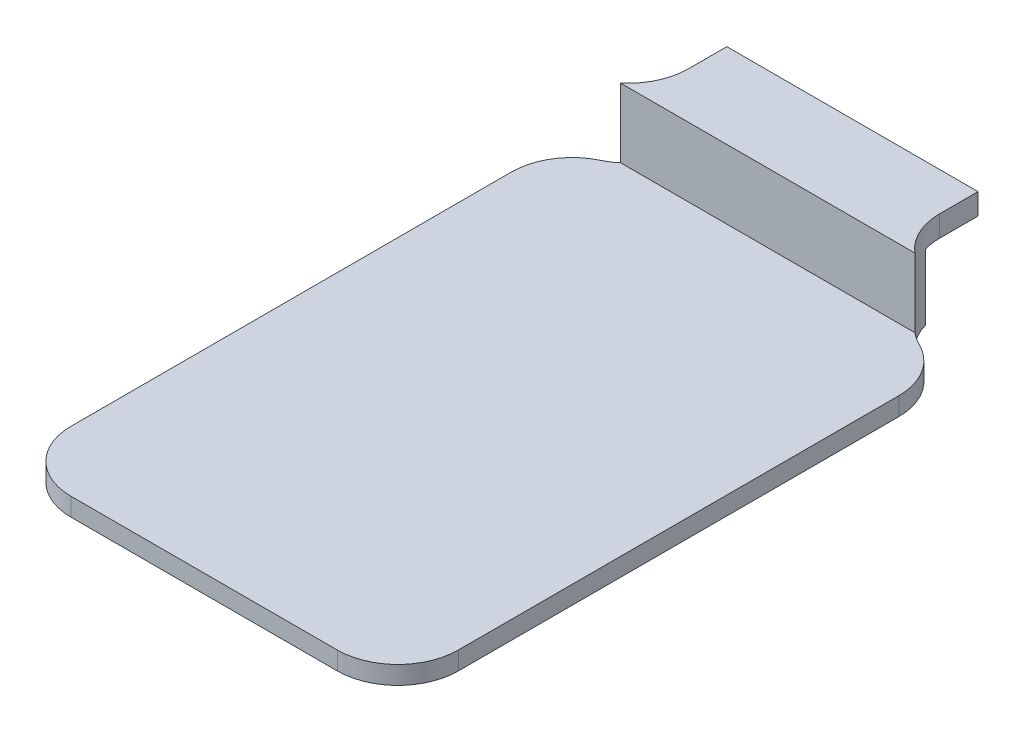
ISO-10303-21;
HEADER;
FILE_DESCRIPTION(('STEP AP214'),'2;1');
FILE_NAME('part.step','',(''),(''),'','','');
FILE_SCHEMA(('AUTOMOTIVE_DESIGN { 1 0 10303 214 1 1 1 1 }'));
ENDSEC;
DATA;
#1=APPLICATION_CONTEXT('core data for automotive mechanical design processes');
#2=APPLICATION_PROTOCOL_DEFINITION('international standard','automotive_design',2000,#1);
#3=PRODUCT_CONTEXT('',#1,'mechanical');
#4=PRODUCT('Part','Part','',(#3));
#5=PRODUCT_RELATED_PRODUCT_CATEGORY('part','',(#4));
#6=PRODUCT_DEFINITION_FORMATION('','',#4);
#7=PRODUCT_DEFINITION_CONTEXT('part definition',#1,'design');
#8=PRODUCT_DEFINITION('design','',#6,#7);
#9=PRODUCT_DEFINITION_SHAPE('','',#8);
#10=(LENGTH_UNIT() NAMED_UNIT(*) SI_UNIT(.MILLI.,.METRE.));
#11=(NAMED_UNIT(*) PLANE_ANGLE_UNIT() SI_UNIT($,.RADIAN.));
#12=(NAMED_UNIT(*) SI_UNIT($,.STERADIAN.) SOLID_ANGLE_UNIT());
#13=UNCERTAINTY_MEASURE_WITH_UNIT(LENGTH_MEASURE(1.E-05),#10,'distance_accuracy_value','');
#14=(GEOMETRIC_REPRESENTATION_CONTEXT(3) GLOBAL_UNCERTAINTY_ASSIGNED_CONTEXT((#13)) GLOBAL_UNIT_ASSIGNED_CONTEXT((#10,
#11,#12)) REPRESENTATION_CONTEXT('',''));
#15=CARTESIAN_POINT('',(0.,0.,0.));
#16=DIRECTION('',(0.,0.,1.));
#17=DIRECTION('',(1.,0.,0.));
#18=AXIS2_PLACEMENT_3D('',#15,#16,#17);
#19=CARTESIAN_POINT('',(11.9303029711438,3.,-52.9287545222048));
#20=DIRECTION('',(1.,0.,0.));
#21=DIRECTION('',(0.,0.,-1.));
#22=AXIS2_PLACEMENT_3D('',#19,#20,#21);
#23=PLANE('',#22);
#24=DIRECTION('',(0.,0.,-1.));
#25=VECTOR('',#24,1.);
#26=CARTESIAN_POINT('',(11.9303029711438,10.9,0.));
#27=LINE('',#26,#25);
#28=CARTESIAN_POINT('',(11.9303029711438,10.9,-55.5843161981421));
#29=VERTEX_POINT('',#28);
#30=CARTESIAN_POINT('',(11.9303029711438,10.9,-61.9287545222048));
#31=VERTEX_POINT('',#30);
#32=EDGE_CURVE('E154',#29,#31,#27,.T.);
#33=ORIENTED_EDGE('',*,*,#32,.F.);
#34=DIRECTION('',(0.,1.,0.));
#35=VECTOR('',#34,1.);
#36=CARTESIAN_POINT('',(11.9303029711438,3.,-55.5843161981421));
#37=LINE('',#36,#35);
#38=CARTESIAN_POINT('',(11.9303029711438,14.4,-55.5843161981421));
#39=VERTEX_POINT('',#38);
#40=EDGE_CURVE('E221',#29,#39,#37,.T.);
#41=ORIENTED_EDGE('',*,*,#40,.T.);
#42=DIRECTION('',(0.,0.,1.));
#43=VECTOR('',#42,1.);
#44=CARTESIAN_POINT('',(11.9303029711438,14.4,0.));
#45=LINE('',#44,#43);
#46=CARTESIAN_POINT('',(11.9303029711438,14.4,-61.9287545222048));
#47=VERTEX_POINT('',#46);
#48=EDGE_CURVE('E172',#47,#39,#45,.T.);
#49=ORIENTED_EDGE('',*,*,#48,.F.);
#50=DIRECTION('',(0.,-1.,0.));
#51=VECTOR('',#50,1.);
#52=CARTESIAN_POINT('',(11.9303029711438,0.,-61.9287545222048));
#53=LINE('',#52,#51);
#54=EDGE_CURVE('E166',#47,#31,#53,.T.);
#55=ORIENTED_EDGE('',*,*,#54,.T.);
#56=EDGE_LOOP('',(#33,#41,#49,#55));
#57=FACE_BOUND('',#56,.T.);
#58=ADVANCED_FACE('F42',(#57),#23,.F.);
#59=CARTESIAN_POINT('',(53.4303029711438,3.,-52.9287545222048));
#60=DIRECTION('',(-1.,0.,0.));
#61=DIRECTION('',(0.,0.,1.));
#62=AXIS2_PLACEMENT_3D('',#59,#60,#61);
#63=PLANE('',#62);
#64=DIRECTION('',(0.,0.,1.));
#65=VECTOR('',#64,1.);
#66=CARTESIAN_POINT('',(53.4303029711438,14.4,0.));
#67=LINE('',#66,#65);
#68=CARTESIAN_POINT('',(53.4303029711438,14.4,-61.9287545222048));
#69=VERTEX_POINT('',#68);
#70=CARTESIAN_POINT('',(53.4303029711438,14.4,-55.5843161981421));
#71=VERTEX_POINT('',#70);
#72=EDGE_CURVE('E167',#69,#71,#67,.T.);
#73=ORIENTED_EDGE('',*,*,#72,.T.);
#74=DIRECTION('',(0.,1.,0.));
#75=VECTOR('',#74,1.);
#76=CARTESIAN_POINT('',(53.4303029711438,3.,-55.5843161981421));
#77=LINE('',#76,#75);
#78=CARTESIAN_POINT('',(53.4303029711438,10.9,-55.5843161981421));
#79=VERTEX_POINT('',#78);
#80=EDGE_CURVE('E225',#71,#79,#77,.F.);
#81=ORIENTED_EDGE('',*,*,#80,.T.);
#82=DIRECTION('',(0.,0.,-1.));
#83=VECTOR('',#82,1.);
#84=CARTESIAN_POINT('',(53.4303029711438,10.9,0.));
#85=LINE('',#84,#83);
#86=CARTESIAN_POINT('',(53.4303029711438,10.9,-61.9287545222048));
#87=VERTEX_POINT('',#86);
#88=EDGE_CURVE('E264',#79,#87,#85,.T.);
#89=ORIENTED_EDGE('',*,*,#88,.T.);
#90=DIRECTION('',(0.,-1.,0.));
#91=VECTOR('',#90,1.);
#92=CARTESIAN_POINT('',(53.4303029711438,0.,-61.9287545222048));
#93=LINE('',#92,#91);
#94=EDGE_CURVE('E177',#69,#87,#93,.T.);
#95=ORIENTED_EDGE('',*,*,#94,.F.);
#96=EDGE_LOOP('',(#73,#81,#89,#95));
#97=FACE_BOUND('',#96,.T.);
#98=ADVANCED_FACE('F262',(#97),#63,.F.);
#99=CARTESIAN_POINT('',(11.9303029711438,3.,-52.9287545222048));
#100=DIRECTION('',(0.,0.,1.));
#101=DIRECTION('',(1.,0.,0.));
#102=AXIS2_PLACEMENT_3D('',#99,#100,#101);
#103=PLANE('',#102);
#104=DIRECTION('',(-1.,0.,0.));
#105=VECTOR('',#104,1.);
#106=CARTESIAN_POINT('',(11.9303029711438,0.,-52.9287545222048));
#107=LINE('',#106,#105);
#108=CARTESIAN_POINT('',(53.7893490668201,0.,-52.9287545222048));
#109=VERTEX_POINT('',#108);
#110=CARTESIAN_POINT('',(11.5712568754674,0.,-52.9287545222048));
#111=VERTEX_POINT('',#110);
#112=EDGE_CURVE('E186',#109,#111,#107,.T.);
#113=ORIENTED_EDGE('',*,*,#112,.T.);
#114=DIRECTION('',(0.,1.,0.));
#115=VECTOR('',#114,1.);
#116=CARTESIAN_POINT('',(11.5712568754674,0.,-52.9287545222048));
#117=LINE('',#116,#115);
#118=CARTESIAN_POINT('',(11.5712568754674,10.9,-52.9287545222048));
#119=VERTEX_POINT('',#118);
#120=EDGE_CURVE('E239',#111,#119,#117,.T.);
#121=ORIENTED_EDGE('',*,*,#120,.T.);
#122=DIRECTION('',(1.,0.,0.));
#123=VECTOR('',#122,1.);
#124=CARTESIAN_POINT('',(11.9303029711438,10.9,-52.9287545222048));
#125=LINE('',#124,#123);
#126=CARTESIAN_POINT('',(53.7893490668201,10.9,-52.9287545222048));
#127=VERTEX_POINT('',#126);
#128=EDGE_CURVE('E179',#119,#127,#125,.T.);
#129=ORIENTED_EDGE('',*,*,#128,.T.);
#130=DIRECTION('',(0.,1.,0.));
#131=VECTOR('',#130,1.);
#132=CARTESIAN_POINT('',(53.7893490668201,10.9,-52.9287545222048));
#133=LINE('',#132,#131);
#134=EDGE_CURVE('E246',#127,#109,#133,.F.);
#135=ORIENTED_EDGE('',*,*,#134,.T.);
#136=EDGE_LOOP('',(#113,#121,#129,#135));
#137=FACE_BOUND('',#136,.T.);
#138=ADVANCED_FACE('F307',(#137),#103,.F.);
#139=CARTESIAN_POINT('',(0.,3.,0.));
#140=DIRECTION('',(0.,1.,0.));
#141=DIRECTION('',(0.,0.,1.));
#142=AXIS2_PLACEMENT_3D('',#139,#140,#141);
#143=PLANE('',#142);
#144=DIRECTION('',(0.,0.,1.));
#145=VECTOR('',#144,1.);
#146=CARTESIAN_POINT('',(0.670302971143767,3.,45.2049139132329));
#147=LINE('',#146,#145);
#148=CARTESIAN_POINT('',(0.670302971143767,3.,-37.5950860867671));
#149=VERTEX_POINT('',#148);
#150=CARTESIAN_POINT('',(0.670302971143767,3.,35.2049139132329));
#151=VERTEX_POINT('',#150);
#152=EDGE_CURVE('E274',#149,#151,#147,.T.);
#153=ORIENTED_EDGE('',*,*,#152,.T.);
#154=CARTESIAN_POINT('',(10.6703029711438,3.,35.2049139132329));
#155=DIRECTION('',(0.,1.,0.));
#156=DIRECTION('',(0.,0.,1.));
#157=AXIS2_PLACEMENT_3D('',#154,#155,#156);
#158=CIRCLE('',#157,10.);
#159=CARTESIAN_POINT('',(10.6703029711438,3.,45.2049139132329));
#160=VERTEX_POINT('',#159);
#161=EDGE_CURVE('E200',#151,#160,#158,.T.);
#162=ORIENTED_EDGE('',*,*,#161,.T.);
#163=DIRECTION('',(1.,0.,0.));
#164=VECTOR('',#163,1.);
#165=CARTESIAN_POINT('',(0.670302971143767,3.,45.2049139132329));
#166=LINE('',#165,#164);
#167=CARTESIAN_POINT('',(54.6903029711438,3.,45.2049139132329));
#168=VERTEX_POINT('',#167);
#169=EDGE_CURVE('E270',#160,#168,#166,.T.);
#170=ORIENTED_EDGE('',*,*,#169,.T.);
#171=CARTESIAN_POINT('',(54.6903029711438,3.,35.2049139132329));
#172=DIRECTION('',(0.,1.,0.));
#173=DIRECTION('',(0.,0.,1.));
#174=AXIS2_PLACEMENT_3D('',#171,#172,#173);
#175=CIRCLE('',#174,10.);
#176=CARTESIAN_POINT('',(64.6903029711438,3.,35.2049139132329));
#177=VERTEX_POINT('',#176);
#178=EDGE_CURVE('E198',#168,#177,#175,.T.);
#179=ORIENTED_EDGE('',*,*,#178,.T.);
#180=DIRECTION('',(0.,0.,-1.));
#181=VECTOR('',#180,1.);
#182=CARTESIAN_POINT('',(64.6903029711438,3.,45.2049139132329));
#183=LINE('',#182,#181);
#184=CARTESIAN_POINT('',(64.6903029711438,3.,-37.5950860867671));
#185=VERTEX_POINT('',#184);
#186=EDGE_CURVE('E277',#177,#185,#183,.T.);
#187=ORIENTED_EDGE('',*,*,#186,.T.);
#188=CARTESIAN_POINT('',(54.6903029711438,3.,-37.5950860867671));
#189=DIRECTION('',(0.,1.,0.));
#190=DIRECTION('',(0.,0.,1.));
#191=AXIS2_PLACEMENT_3D('',#188,#189,#190);
#192=CIRCLE('',#191,10.);
#193=CARTESIAN_POINT('',(59.0603029711438,3.,-46.5897011424546));
#194=VERTEX_POINT('',#193);
#195=EDGE_CURVE('E195',#185,#194,#192,.T.);
#196=ORIENTED_EDGE('',*,*,#195,.T.);
#197=CARTESIAN_POINT('',(63.4303029711438,3.,-55.5843161981421));
#198=DIRECTION('',(0.,1.,0.));
#199=DIRECTION('',(0.,0.,1.));
#200=AXIS2_PLACEMENT_3D('',#197,#198,#199);
#201=CIRCLE('',#200,10.);
#202=CARTESIAN_POINT('',(56.996612317567,3.,-47.9287545222048));
#203=VERTEX_POINT('',#202);
#204=EDGE_CURVE('E251',#194,#203,#201,.F.);
#205=ORIENTED_EDGE('',*,*,#204,.T.);
#206=DIRECTION('',(1.,0.,0.));
#207=VECTOR('',#206,1.);
#208=CARTESIAN_POINT('',(11.9303029711438,3.,-47.9287545222048));
#209=LINE('',#208,#207);
#210=CARTESIAN_POINT('',(8.36399362472046,3.,-47.9287545222048));
#211=VERTEX_POINT('',#210);
#212=EDGE_CURVE('E63',#211,#203,#209,.T.);
#213=ORIENTED_EDGE('',*,*,#212,.F.);
#214=CARTESIAN_POINT('',(1.93030297114375,3.,-55.5843161981421));
#215=DIRECTION('',(0.,1.,0.));
#216=DIRECTION('',(0.,0.,1.));
#217=AXIS2_PLACEMENT_3D('',#214,#215,#216);
#218=CIRCLE('',#217,10.);
#219=CARTESIAN_POINT('',(6.30030297114376,3.,-46.5897011424546));
#220=VERTEX_POINT('',#219);
#221=EDGE_CURVE('E234',#211,#220,#218,.F.);
#222=ORIENTED_EDGE('',*,*,#221,.T.);
#223=CARTESIAN_POINT('',(10.6703029711438,3.,-37.5950860867671));
#224=DIRECTION('',(0.,1.,0.));
#225=DIRECTION('',(0.,0.,1.));
#226=AXIS2_PLACEMENT_3D('',#223,#224,#225);
#227=CIRCLE('',#226,10.);
#228=EDGE_CURVE('E193',#220,#149,#227,.T.);
#229=ORIENTED_EDGE('',*,*,#228,.T.);
#230=EDGE_LOOP('',(#153,#162,#170,#179,#187,#196,#205,#213,#222,#229));
#231=FACE_BOUND('',#230,.T.);
#232=ADVANCED_FACE('F299',(#231),#143,.T.);
#233=CARTESIAN_POINT('',(0.,0.,0.));
#234=DIRECTION('',(0.,1.,0.));
#235=DIRECTION('',(0.,0.,1.));
#236=AXIS2_PLACEMENT_3D('',#233,#234,#235);
#237=PLANE('',#236);
#238=DIRECTION('',(1.,0.,0.));
#239=VECTOR('',#238,1.);
#240=CARTESIAN_POINT('',(0.670302971143767,0.,45.2049139132329));
#241=LINE('',#240,#239);
#242=CARTESIAN_POINT('',(10.6703029711438,0.,45.2049139132329));
#243=VERTEX_POINT('',#242);
#244=CARTESIAN_POINT('',(54.6903029711438,0.,45.2049139132329));
#245=VERTEX_POINT('',#244);
#246=EDGE_CURVE('E268',#243,#245,#241,.T.);
#247=ORIENTED_EDGE('',*,*,#246,.F.);
#248=CARTESIAN_POINT('',(10.6703029711438,0.,35.2049139132329));
#249=DIRECTION('',(0.,1.,0.));
#250=DIRECTION('',(0.,0.,1.));
#251=AXIS2_PLACEMENT_3D('',#248,#249,#250);
#252=CIRCLE('',#251,10.);
#253=CARTESIAN_POINT('',(0.670302971143767,0.,35.2049139132329));
#254=VERTEX_POINT('',#253);
#255=EDGE_CURVE('E214',#243,#254,#252,.F.);
#256=ORIENTED_EDGE('',*,*,#255,.T.);
#257=DIRECTION('',(0.,0.,1.));
#258=VECTOR('',#257,1.);
#259=CARTESIAN_POINT('',(0.670302971143767,0.,45.2049139132329));
#260=LINE('',#259,#258);
#261=CARTESIAN_POINT('',(0.670302971143767,0.,-37.5950860867671));
#262=VERTEX_POINT('',#261);
#263=EDGE_CURVE('E282',#262,#254,#260,.T.);
#264=ORIENTED_EDGE('',*,*,#263,.F.);
#265=CARTESIAN_POINT('',(10.6703029711438,0.,-37.5950860867671));
#266=DIRECTION('',(0.,1.,0.));
#267=DIRECTION('',(0.,0.,1.));
#268=AXIS2_PLACEMENT_3D('',#265,#266,#267);
#269=CIRCLE('',#268,10.);
#270=CARTESIAN_POINT('',(6.30030297114376,0.,-46.5897011424546));
#271=VERTEX_POINT('',#270);
#272=EDGE_CURVE('E207',#262,#271,#269,.F.);
#273=ORIENTED_EDGE('',*,*,#272,.T.);
#274=CARTESIAN_POINT('',(1.93030297114375,0.,-55.5843161981421));
#275=DIRECTION('',(0.,1.,0.));
#276=DIRECTION('',(0.,0.,1.));
#277=AXIS2_PLACEMENT_3D('',#274,#275,#276);
#278=CIRCLE('',#277,10.);
#279=EDGE_CURVE('E236',#271,#111,#278,.T.);
#280=ORIENTED_EDGE('',*,*,#279,.T.);
#281=ORIENTED_EDGE('',*,*,#112,.F.);
#282=CARTESIAN_POINT('',(63.4303029711438,0.,-55.5843161981421));
#283=DIRECTION('',(0.,1.,0.));
#284=DIRECTION('',(0.,0.,1.));
#285=AXIS2_PLACEMENT_3D('',#282,#283,#284);
#286=CIRCLE('',#285,10.);
#287=CARTESIAN_POINT('',(59.0603029711438,0.,-46.5897011424546));
#288=VERTEX_POINT('',#287);
#289=EDGE_CURVE('E249',#109,#288,#286,.T.);
#290=ORIENTED_EDGE('',*,*,#289,.T.);
#291=CARTESIAN_POINT('',(54.6903029711438,0.,-37.5950860867671));
#292=DIRECTION('',(0.,1.,0.));
#293=DIRECTION('',(0.,0.,1.));
#294=AXIS2_PLACEMENT_3D('',#291,#292,#293);
#295=CIRCLE('',#294,10.);
#296=CARTESIAN_POINT('',(64.6903029711438,0.,-37.5950860867671));
#297=VERTEX_POINT('',#296);
#298=EDGE_CURVE('E210',#288,#297,#295,.F.);
#299=ORIENTED_EDGE('',*,*,#298,.T.);
#300=DIRECTION('',(0.,0.,-1.));
#301=VECTOR('',#300,1.);
#302=CARTESIAN_POINT('',(64.6903029711438,0.,45.2049139132329));
#303=LINE('',#302,#301);
#304=CARTESIAN_POINT('',(64.6903029711438,0.,35.2049139132329));
#305=VERTEX_POINT('',#304);
#306=EDGE_CURVE('E273',#305,#297,#303,.T.);
#307=ORIENTED_EDGE('',*,*,#306,.F.);
#308=CARTESIAN_POINT('',(54.6903029711438,0.,35.2049139132329));
#309=DIRECTION('',(0.,1.,0.));
#310=DIRECTION('',(0.,0.,1.));
#311=AXIS2_PLACEMENT_3D('',#308,#309,#310);
#312=CIRCLE('',#311,10.);
#313=EDGE_CURVE('E212',#305,#245,#312,.F.);
#314=ORIENTED_EDGE('',*,*,#313,.T.);
#315=EDGE_LOOP('',(#247,#256,#264,#273,#280,#281,#290,#299,#307,#314));
#316=FACE_BOUND('',#315,.T.);
#317=ADVANCED_FACE('F303',(#316),#237,.F.);
#318=CARTESIAN_POINT('',(11.9303029711438,0.,-47.9287545222048));
#319=DIRECTION('',(0.,0.,-1.));
#320=DIRECTION('',(-1.,0.,0.));
#321=AXIS2_PLACEMENT_3D('',#318,#319,#320);
#322=PLANE('',#321);
#323=ORIENTED_EDGE('',*,*,#212,.T.);
#324=DIRECTION('',(0.,1.,0.));
#325=VECTOR('',#324,1.);
#326=CARTESIAN_POINT('',(56.996612317567,3.,-47.9287545222048));
#327=LINE('',#326,#325);
#328=CARTESIAN_POINT('',(56.996612317567,14.4,-47.9287545222048));
#329=VERTEX_POINT('',#328);
#330=EDGE_CURVE('E50',#203,#329,#327,.T.);
#331=ORIENTED_EDGE('',*,*,#330,.T.);
#332=DIRECTION('',(1.,0.,0.));
#333=VECTOR('',#332,1.);
#334=CARTESIAN_POINT('',(11.9303029711438,14.4,-47.9287545222048));
#335=LINE('',#334,#333);
#336=CARTESIAN_POINT('',(8.36399362472046,14.4,-47.9287545222048));
#337=VERTEX_POINT('',#336);
#338=EDGE_CURVE('E56',#337,#329,#335,.T.);
#339=ORIENTED_EDGE('',*,*,#338,.F.);
#340=DIRECTION('',(0.,1.,0.));
#341=VECTOR('',#340,1.);
#342=CARTESIAN_POINT('',(8.36399362472046,14.4,-47.9287545222048));
#343=LINE('',#342,#341);
#344=EDGE_CURVE('E232',#337,#211,#343,.F.);
#345=ORIENTED_EDGE('',*,*,#344,.T.);
#346=EDGE_LOOP('',(#323,#331,#339,#345));
#347=FACE_BOUND('',#346,.T.);
#348=ADVANCED_FACE('F254',(#347),#322,.F.);
#349=CARTESIAN_POINT('',(11.9303029711438,14.4,0.));
#350=DIRECTION('',(0.,1.,0.));
#351=DIRECTION('',(0.,0.,1.));
#352=AXIS2_PLACEMENT_3D('',#349,#350,#351);
#353=PLANE('',#352);
#354=ORIENTED_EDGE('',*,*,#72,.F.);
#355=DIRECTION('',(1.,0.,0.));
#356=VECTOR('',#355,1.);
#357=CARTESIAN_POINT('',(11.9303029711438,14.4,-61.9287545222048));
#358=LINE('',#357,#356);
#359=EDGE_CURVE('E178',#47,#69,#358,.T.);
#360=ORIENTED_EDGE('',*,*,#359,.F.);
#361=ORIENTED_EDGE('',*,*,#48,.T.);
#362=CARTESIAN_POINT('',(1.93030297114375,14.4,-55.5843161981421));
#363=DIRECTION('',(0.,1.,0.));
#364=DIRECTION('',(0.,0.,1.));
#365=AXIS2_PLACEMENT_3D('',#362,#363,#364);
#366=CIRCLE('',#365,10.);
#367=EDGE_CURVE('E230',#39,#337,#366,.F.);
#368=ORIENTED_EDGE('',*,*,#367,.T.);
#369=ORIENTED_EDGE('',*,*,#338,.T.);
#370=CARTESIAN_POINT('',(63.4303029711438,14.4,-55.5843161981421));
#371=DIRECTION('',(0.,1.,0.));
#372=DIRECTION('',(0.,0.,1.));
#373=AXIS2_PLACEMENT_3D('',#370,#371,#372);
#374=CIRCLE('',#373,10.);
#375=EDGE_CURVE('E11',#329,#71,#374,.F.);
#376=ORIENTED_EDGE('',*,*,#375,.T.);
#377=EDGE_LOOP('',(#354,#360,#361,#368,#369,#376));
#378=FACE_BOUND('',#377,.T.);
#379=ADVANCED_FACE('F260',(#378),#353,.T.);
#380=CARTESIAN_POINT('',(11.9303029711438,0.,-61.9287545222048));
#381=DIRECTION('',(0.,0.,1.));
#382=DIRECTION('',(1.,0.,0.));
#383=AXIS2_PLACEMENT_3D('',#380,#381,#382);
#384=PLANE('',#383);
#385=ORIENTED_EDGE('',*,*,#94,.T.);
#386=DIRECTION('',(1.,0.,0.));
#387=VECTOR('',#386,1.);
#388=CARTESIAN_POINT('',(11.9303029711438,10.9,-61.9287545222048));
#389=LINE('',#388,#387);
#390=EDGE_CURVE('E159',#31,#87,#389,.T.);
#391=ORIENTED_EDGE('',*,*,#390,.F.);
#392=ORIENTED_EDGE('',*,*,#54,.F.);
#393=ORIENTED_EDGE('',*,*,#359,.T.);
#394=EDGE_LOOP('',(#385,#391,#392,#393));
#395=FACE_BOUND('',#394,.T.);
#396=ADVANCED_FACE('F175',(#395),#384,.F.);
#397=CARTESIAN_POINT('',(11.9303029711438,10.9,0.));
#398=DIRECTION('',(0.,-1.,0.));
#399=DIRECTION('',(0.,0.,-1.));
#400=AXIS2_PLACEMENT_3D('',#397,#398,#399);
#401=PLANE('',#400);
#402=ORIENTED_EDGE('',*,*,#88,.F.);
#403=CARTESIAN_POINT('',(63.4303029711438,10.9,-55.5843161981421));
#404=DIRECTION('',(0.,-1.,0.));
#405=DIRECTION('',(0.,0.,-1.));
#406=AXIS2_PLACEMENT_3D('',#403,#404,#405);
#407=CIRCLE('',#406,10.);
#408=EDGE_CURVE('E243',#79,#127,#407,.F.);
#409=ORIENTED_EDGE('',*,*,#408,.T.);
#410=ORIENTED_EDGE('',*,*,#128,.F.);
#411=CARTESIAN_POINT('',(1.93030297114375,10.9,-55.5843161981421));
#412=DIRECTION('',(0.,-1.,0.));
#413=DIRECTION('',(0.,0.,-1.));
#414=AXIS2_PLACEMENT_3D('',#411,#412,#413);
#415=CIRCLE('',#414,10.);
#416=EDGE_CURVE('E162',#119,#29,#415,.F.);
#417=ORIENTED_EDGE('',*,*,#416,.T.);
#418=ORIENTED_EDGE('',*,*,#32,.T.);
#419=ORIENTED_EDGE('',*,*,#390,.T.);
#420=EDGE_LOOP('',(#402,#409,#410,#417,#418,#419));
#421=FACE_BOUND('',#420,.T.);
#422=ADVANCED_FACE('F157',(#421),#401,.T.);
#423=CARTESIAN_POINT('',(64.6903029711438,0.,45.2049139132329));
#424=DIRECTION('',(1.,0.,0.));
#425=DIRECTION('',(0.,0.,-1.));
#426=AXIS2_PLACEMENT_3D('',#423,#424,#425);
#427=PLANE('',#426);
#428=ORIENTED_EDGE('',*,*,#186,.F.);
#429=DIRECTION('',(0.,1.,0.));
#430=VECTOR('',#429,1.);
#431=CARTESIAN_POINT('',(64.6903029711438,0.,35.2049139132329));
#432=LINE('',#431,#430);
#433=EDGE_CURVE('E219',#177,#305,#432,.F.);
#434=ORIENTED_EDGE('',*,*,#433,.T.);
#435=ORIENTED_EDGE('',*,*,#306,.T.);
#436=DIRECTION('',(0.,1.,0.));
#437=VECTOR('',#436,1.);
#438=CARTESIAN_POINT('',(64.6903029711438,0.,-37.5950860867671));
#439=LINE('',#438,#437);
#440=EDGE_CURVE('E216',#297,#185,#439,.T.);
#441=ORIENTED_EDGE('',*,*,#440,.T.);
#442=EDGE_LOOP('',(#428,#434,#435,#441));
#443=FACE_BOUND('',#442,.T.);
#444=ADVANCED_FACE('F290',(#443),#427,.T.);
#445=CARTESIAN_POINT('',(0.670302971143767,0.,45.2049139132329));
#446=DIRECTION('',(0.,0.,1.));
#447=DIRECTION('',(1.,0.,0.));
#448=AXIS2_PLACEMENT_3D('',#445,#446,#447);
#449=PLANE('',#448);
#450=ORIENTED_EDGE('',*,*,#169,.F.);
#451=DIRECTION('',(0.,1.,0.));
#452=VECTOR('',#451,1.);
#453=CARTESIAN_POINT('',(10.6703029711438,0.,45.2049139132329));
#454=LINE('',#453,#452);
#455=EDGE_CURVE('E205',#160,#243,#454,.F.);
#456=ORIENTED_EDGE('',*,*,#455,.T.);
#457=ORIENTED_EDGE('',*,*,#246,.T.);
#458=DIRECTION('',(0.,1.,0.));
#459=VECTOR('',#458,1.);
#460=CARTESIAN_POINT('',(54.6903029711438,0.,45.2049139132329));
#461=LINE('',#460,#459);
#462=EDGE_CURVE('E202',#245,#168,#461,.T.);
#463=ORIENTED_EDGE('',*,*,#462,.T.);
#464=EDGE_LOOP('',(#450,#456,#457,#463));
#465=FACE_BOUND('',#464,.T.);
#466=ADVANCED_FACE('F329',(#465),#449,.T.);
#467=CARTESIAN_POINT('',(0.670302971143767,0.,45.2049139132329));
#468=DIRECTION('',(-1.,0.,0.));
#469=DIRECTION('',(0.,0.,1.));
#470=AXIS2_PLACEMENT_3D('',#467,#468,#469);
#471=PLANE('',#470);
#472=ORIENTED_EDGE('',*,*,#263,.T.);
#473=DIRECTION('',(0.,1.,0.));
#474=VECTOR('',#473,1.);
#475=CARTESIAN_POINT('',(0.670302971143767,0.,35.2049139132329));
#476=LINE('',#475,#474);
#477=EDGE_CURVE('E190',#254,#151,#476,.T.);
#478=ORIENTED_EDGE('',*,*,#477,.T.);
#479=ORIENTED_EDGE('',*,*,#152,.F.);
#480=DIRECTION('',(0.,1.,0.));
#481=VECTOR('',#480,1.);
#482=CARTESIAN_POINT('',(0.670302971143767,0.,-37.5950860867671));
#483=LINE('',#482,#481);
#484=EDGE_CURVE('E188',#149,#262,#483,.F.);
#485=ORIENTED_EDGE('',*,*,#484,.T.);
#486=EDGE_LOOP('',(#472,#478,#479,#485));
#487=FACE_BOUND('',#486,.T.);
#488=ADVANCED_FACE('F321',(#487),#471,.T.);
#489=CARTESIAN_POINT('',(10.6703029711438,0.,35.2049139132329));
#490=DIRECTION('',(0.,1.,0.));
#491=DIRECTION('',(0.,0.,1.));
#492=AXIS2_PLACEMENT_3D('',#489,#490,#491);
#493=CYLINDRICAL_SURFACE('',#492,10.);
#494=ORIENTED_EDGE('',*,*,#255,.F.);
#495=ORIENTED_EDGE('',*,*,#455,.F.);
#496=ORIENTED_EDGE('',*,*,#161,.F.);
#497=ORIENTED_EDGE('',*,*,#477,.F.);
#498=EDGE_LOOP('',(#494,#495,#496,#497));
#499=FACE_BOUND('',#498,.T.);
#500=ADVANCED_FACE('F326',(#499),#493,.T.);
#501=CARTESIAN_POINT('',(54.6903029711438,0.,35.2049139132329));
#502=DIRECTION('',(0.,1.,0.));
#503=DIRECTION('',(0.,0.,1.));
#504=AXIS2_PLACEMENT_3D('',#501,#502,#503);
#505=CYLINDRICAL_SURFACE('',#504,10.);
#506=ORIENTED_EDGE('',*,*,#313,.F.);
#507=ORIENTED_EDGE('',*,*,#433,.F.);
#508=ORIENTED_EDGE('',*,*,#178,.F.);
#509=ORIENTED_EDGE('',*,*,#462,.F.);
#510=EDGE_LOOP('',(#506,#507,#508,#509));
#511=FACE_BOUND('',#510,.T.);
#512=ADVANCED_FACE('F332',(#511),#505,.T.);
#513=CARTESIAN_POINT('',(54.6903029711438,0.,-37.5950860867671));
#514=DIRECTION('',(0.,1.,0.));
#515=DIRECTION('',(0.,0.,1.));
#516=AXIS2_PLACEMENT_3D('',#513,#514,#515);
#517=CYLINDRICAL_SURFACE('',#516,10.);
#518=ORIENTED_EDGE('',*,*,#298,.F.);
#519=DIRECTION('',(0.,1.,0.));
#520=VECTOR('',#519,1.);
#521=CARTESIAN_POINT('',(59.0603029711438,0.,-46.5897011424546));
#522=LINE('',#521,#520);
#523=EDGE_CURVE('E228',#288,#194,#522,.T.);
#524=ORIENTED_EDGE('',*,*,#523,.T.);
#525=ORIENTED_EDGE('',*,*,#195,.F.);
#526=ORIENTED_EDGE('',*,*,#440,.F.);
#527=EDGE_LOOP('',(#518,#524,#525,#526));
#528=FACE_BOUND('',#527,.T.);
#529=ADVANCED_FACE('F296',(#528),#517,.T.);
#530=CARTESIAN_POINT('',(10.6703029711438,0.,-37.5950860867671));
#531=DIRECTION('',(0.,1.,0.));
#532=DIRECTION('',(0.,0.,1.));
#533=AXIS2_PLACEMENT_3D('',#530,#531,#532);
#534=CYLINDRICAL_SURFACE('',#533,10.);
#535=ORIENTED_EDGE('',*,*,#228,.F.);
#536=DIRECTION('',(0.,1.,0.));
#537=VECTOR('',#536,1.);
#538=CARTESIAN_POINT('',(6.30030297114376,0.,-46.5897011424546));
#539=LINE('',#538,#537);
#540=EDGE_CURVE('E223',#220,#271,#539,.F.);
#541=ORIENTED_EDGE('',*,*,#540,.T.);
#542=ORIENTED_EDGE('',*,*,#272,.F.);
#543=ORIENTED_EDGE('',*,*,#484,.F.);
#544=EDGE_LOOP('',(#535,#541,#542,#543));
#545=FACE_BOUND('',#544,.T.);
#546=ADVANCED_FACE('F317',(#545),#534,.T.);
#547=CARTESIAN_POINT('',(1.93030297114375,0.,-55.5843161981421));
#548=DIRECTION('',(0.,1.,0.));
#549=DIRECTION('',(0.,0.,1.));
#550=AXIS2_PLACEMENT_3D('',#547,#548,#549);
#551=CYLINDRICAL_SURFACE('',#550,10.);
#552=ORIENTED_EDGE('',*,*,#279,.F.);
#553=ORIENTED_EDGE('',*,*,#540,.F.);
#554=ORIENTED_EDGE('',*,*,#221,.F.);
#555=ORIENTED_EDGE('',*,*,#344,.F.);
#556=ORIENTED_EDGE('',*,*,#367,.F.);
#557=ORIENTED_EDGE('',*,*,#40,.F.);
#558=ORIENTED_EDGE('',*,*,#416,.F.);
#559=ORIENTED_EDGE('',*,*,#120,.F.);
#560=EDGE_LOOP('',(#552,#553,#554,#555,#556,#557,#558,#559));
#561=FACE_BOUND('',#560,.T.);
#562=ADVANCED_FACE('F309',(#561),#551,.F.);
#563=CARTESIAN_POINT('',(63.4303029711438,0.,-55.5843161981421));
#564=DIRECTION('',(0.,1.,0.));
#565=DIRECTION('',(0.,0.,1.));
#566=AXIS2_PLACEMENT_3D('',#563,#564,#565);
#567=CYLINDRICAL_SURFACE('',#566,10.);
#568=ORIENTED_EDGE('',*,*,#204,.F.);
#569=ORIENTED_EDGE('',*,*,#523,.F.);
#570=ORIENTED_EDGE('',*,*,#289,.F.);
#571=ORIENTED_EDGE('',*,*,#134,.F.);
#572=ORIENTED_EDGE('',*,*,#408,.F.);
#573=ORIENTED_EDGE('',*,*,#80,.F.);
#574=ORIENTED_EDGE('',*,*,#375,.F.);
#575=ORIENTED_EDGE('',*,*,#330,.F.);
#576=EDGE_LOOP('',(#568,#569,#570,#571,#572,#573,#574,#575));
#577=FACE_BOUND('',#576,.T.);
#578=ADVANCED_FACE('F44',(#577),#567,.F.);
#579=CLOSED_SHELL('',(#58,#98,#138,#232,#317,#348,#379,#396,#422,#444,#466,#488,#500,#512,#529,
#546,#562,#578));
#580=MANIFOLD_SOLID_BREP('B2',#579);
#581=ADVANCED_BREP_SHAPE_REPRESENTATION('',(#18,#580),#14);
#582=SHAPE_DEFINITION_REPRESENTATION(#9,#581);
ENDSEC;
END-ISO-10303-21;
